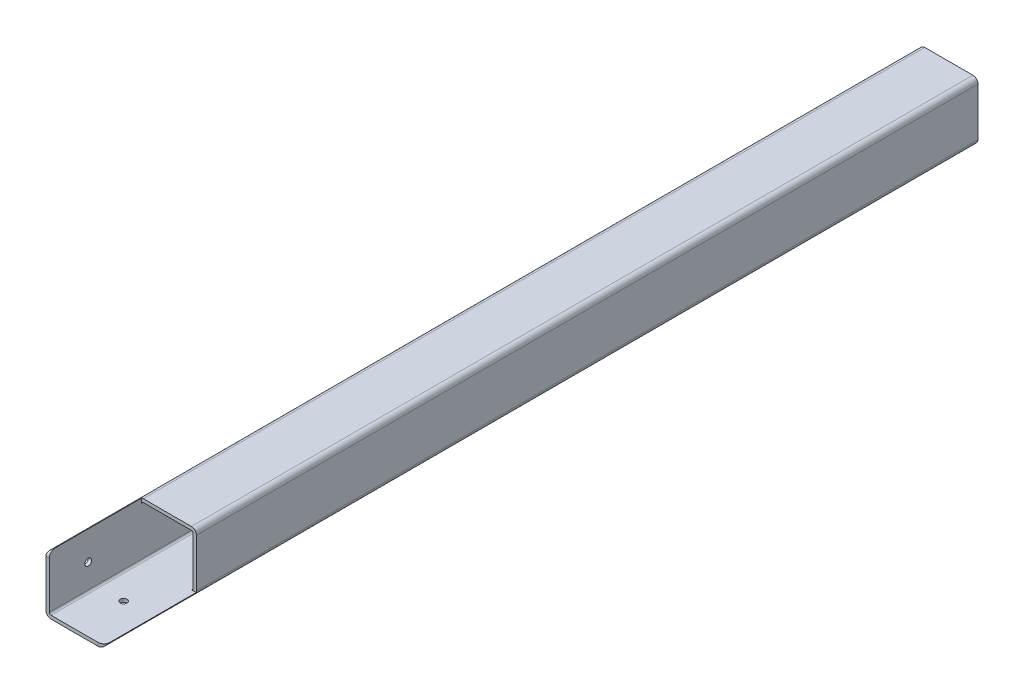
ISO-10303-21;
HEADER;
FILE_DESCRIPTION(('STEP AP214'),'2;1');
FILE_NAME('part.step','',(''),(''),'','','');
FILE_SCHEMA(('AUTOMOTIVE_DESIGN { 1 0 10303 214 1 1 1 1 }'));
ENDSEC;
DATA;
#1=APPLICATION_CONTEXT('core data for automotive mechanical design processes');
#2=APPLICATION_PROTOCOL_DEFINITION('international standard','automotive_design',2000,#1);
#3=PRODUCT_CONTEXT('',#1,'mechanical');
#4=PRODUCT('Part','Part','',(#3));
#5=PRODUCT_RELATED_PRODUCT_CATEGORY('part','',(#4));
#6=PRODUCT_DEFINITION_FORMATION('','',#4);
#7=PRODUCT_DEFINITION_CONTEXT('part definition',#1,'design');
#8=PRODUCT_DEFINITION('design','',#6,#7);
#9=PRODUCT_DEFINITION_SHAPE('','',#8);
#10=(LENGTH_UNIT() NAMED_UNIT(*) SI_UNIT(.MILLI.,.METRE.));
#11=(NAMED_UNIT(*) PLANE_ANGLE_UNIT() SI_UNIT($,.RADIAN.));
#12=(NAMED_UNIT(*) SI_UNIT($,.STERADIAN.) SOLID_ANGLE_UNIT());
#13=UNCERTAINTY_MEASURE_WITH_UNIT(LENGTH_MEASURE(1.E-05),#10,'distance_accuracy_value','');
#14=(GEOMETRIC_REPRESENTATION_CONTEXT(3) GLOBAL_UNCERTAINTY_ASSIGNED_CONTEXT((#13)) GLOBAL_UNIT_ASSIGNED_CONTEXT((#10,
#11,#12)) REPRESENTATION_CONTEXT('',''));
#15=CARTESIAN_POINT('',(0.,0.,0.));
#16=DIRECTION('',(0.,0.,1.));
#17=DIRECTION('',(1.,0.,0.));
#18=AXIS2_PLACEMENT_3D('',#15,#16,#17);
#19=CARTESIAN_POINT('',(24.75,-24.75,450.));
#20=DIRECTION('',(0.,0.,1.));
#21=DIRECTION('',(1.,0.,0.));
#22=AXIS2_PLACEMENT_3D('',#19,#20,#21);
#23=PLANE('',#22);
#24=DIRECTION('',(-1.,0.,0.));
#25=VECTOR('',#24,1.);
#26=CARTESIAN_POINT('',(30.,23.6997474683058,450.));
#27=LINE('',#26,#25);
#28=CARTESIAN_POINT('',(-26.5,23.6997474683058,450.));
#29=VERTEX_POINT('',#28);
#30=CARTESIAN_POINT('',(-30.,23.6997474683058,450.));
#31=VERTEX_POINT('',#30);
#32=EDGE_CURVE('E51',#29,#31,#27,.T.);
#33=ORIENTED_EDGE('',*,*,#32,.T.);
#34=DIRECTION('',(0.,-1.,0.));
#35=VECTOR('',#34,1.);
#36=CARTESIAN_POINT('',(-30.,24.75,450.));
#37=LINE('',#36,#35);
#38=CARTESIAN_POINT('',(-30.,-24.75,450.));
#39=VERTEX_POINT('',#38);
#40=EDGE_CURVE('E181',#31,#39,#37,.T.);
#41=ORIENTED_EDGE('',*,*,#40,.T.);
#42=CARTESIAN_POINT('',(-24.75,-24.75,450.));
#43=DIRECTION('',(0.,0.,1.));
#44=DIRECTION('',(1.,0.,0.));
#45=AXIS2_PLACEMENT_3D('',#42,#43,#44);
#46=CIRCLE('',#45,5.25);
#47=CARTESIAN_POINT('',(-24.75,-30.,450.));
#48=VERTEX_POINT('',#47);
#49=EDGE_CURVE('E191',#39,#48,#46,.T.);
#50=ORIENTED_EDGE('',*,*,#49,.T.);
#51=DIRECTION('',(1.,0.,0.));
#52=VECTOR('',#51,1.);
#53=CARTESIAN_POINT('',(-24.75,-30.,450.));
#54=LINE('',#53,#52);
#55=CARTESIAN_POINT('',(23.6997474683058,-30.,450.));
#56=VERTEX_POINT('',#55);
#57=EDGE_CURVE('E194',#48,#56,#54,.T.);
#58=ORIENTED_EDGE('',*,*,#57,.T.);
#59=DIRECTION('',(0.,-1.,0.));
#60=VECTOR('',#59,1.);
#61=CARTESIAN_POINT('',(23.6997474683058,30.,450.));
#62=LINE('',#61,#60);
#63=CARTESIAN_POINT('',(23.6997474683058,-26.5,450.));
#64=VERTEX_POINT('',#63);
#65=EDGE_CURVE('E253',#64,#56,#62,.T.);
#66=ORIENTED_EDGE('',*,*,#65,.F.);
#67=DIRECTION('',(1.,0.,0.));
#68=VECTOR('',#67,1.);
#69=CARTESIAN_POINT('',(-24.75,-26.5,450.));
#70=LINE('',#69,#68);
#71=CARTESIAN_POINT('',(-24.75,-26.5,450.));
#72=VERTEX_POINT('',#71);
#73=EDGE_CURVE('E409',#72,#64,#70,.T.);
#74=ORIENTED_EDGE('',*,*,#73,.F.);
#75=CARTESIAN_POINT('',(-24.75,-24.75,450.));
#76=DIRECTION('',(0.,0.,1.));
#77=DIRECTION('',(1.,0.,0.));
#78=AXIS2_PLACEMENT_3D('',#75,#76,#77);
#79=CIRCLE('',#78,1.75);
#80=CARTESIAN_POINT('',(-26.5,-24.75,450.));
#81=VERTEX_POINT('',#80);
#82=EDGE_CURVE('E405',#81,#72,#79,.T.);
#83=ORIENTED_EDGE('',*,*,#82,.F.);
#84=DIRECTION('',(0.,-1.,0.));
#85=VECTOR('',#84,1.);
#86=CARTESIAN_POINT('',(-26.5,24.75,450.));
#87=LINE('',#86,#85);
#88=EDGE_CURVE('E184',#29,#81,#87,.T.);
#89=ORIENTED_EDGE('',*,*,#88,.F.);
#90=EDGE_LOOP('',(#33,#41,#50,#58,#66,#74,#83,#89));
#91=FACE_BOUND('',#90,.T.);
#92=ADVANCED_FACE('F35',(#91),#23,.T.);
#93=CARTESIAN_POINT('',(30.,-24.75,450.));
#94=DIRECTION('',(-1.,0.,0.));
#95=DIRECTION('',(0.,-1.,0.));
#96=AXIS2_PLACEMENT_3D('',#93,#94,#95);
#97=PLANE('',#96);
#98=DIRECTION('',(0.,1.,0.));
#99=VECTOR('',#98,1.);
#100=CARTESIAN_POINT('',(30.,30.,355.));
#101=LINE('',#100,#99);
#102=CARTESIAN_POINT('',(30.,-24.75,355.));
#103=VERTEX_POINT('',#102);
#104=CARTESIAN_POINT('',(30.,24.75,355.));
#105=VERTEX_POINT('',#104);
#106=EDGE_CURVE('E371',#103,#105,#101,.T.);
#107=ORIENTED_EDGE('',*,*,#106,.F.);
#108=DIRECTION('',(0.,0.,-1.));
#109=VECTOR('',#108,1.);
#110=CARTESIAN_POINT('',(30.,-24.75,450.));
#111=LINE('',#110,#109);
#112=CARTESIAN_POINT('',(30.,-24.75,-450.));
#113=VERTEX_POINT('',#112);
#114=EDGE_CURVE('E237',#103,#113,#111,.T.);
#115=ORIENTED_EDGE('',*,*,#114,.T.);
#116=DIRECTION('',(0.,1.,0.));
#117=VECTOR('',#116,1.);
#118=CARTESIAN_POINT('',(30.,-24.75,-450.));
#119=LINE('',#118,#117);
#120=CARTESIAN_POINT('',(30.,24.75,-450.));
#121=VERTEX_POINT('',#120);
#122=EDGE_CURVE('E209',#113,#121,#119,.T.);
#123=ORIENTED_EDGE('',*,*,#122,.T.);
#124=DIRECTION('',(0.,0.,-1.));
#125=VECTOR('',#124,1.);
#126=CARTESIAN_POINT('',(30.,24.75,450.));
#127=LINE('',#126,#125);
#128=EDGE_CURVE('E235',#105,#121,#127,.T.);
#129=ORIENTED_EDGE('',*,*,#128,.F.);
#130=EDGE_LOOP('',(#107,#115,#123,#129));
#131=FACE_BOUND('',#130,.T.);
#132=ADVANCED_FACE('F311',(#131),#97,.F.);
#133=CARTESIAN_POINT('',(24.75,24.75,450.));
#134=DIRECTION('',(0.,0.,-1.));
#135=DIRECTION('',(-1.,0.,0.));
#136=AXIS2_PLACEMENT_3D('',#133,#134,#135);
#137=CYLINDRICAL_SURFACE('',#136,5.25);
#138=CARTESIAN_POINT('',(24.75,24.75,355.));
#139=DIRECTION('',(0.,0.,1.));
#140=DIRECTION('',(1.,0.,0.));
#141=AXIS2_PLACEMENT_3D('',#138,#139,#140);
#142=CIRCLE('',#141,5.25);
#143=CARTESIAN_POINT('',(24.75,30.,355.));
#144=VERTEX_POINT('',#143);
#145=EDGE_CURVE('E396',#105,#144,#142,.T.);
#146=ORIENTED_EDGE('',*,*,#145,.F.);
#147=ORIENTED_EDGE('',*,*,#128,.T.);
#148=CARTESIAN_POINT('',(24.75,24.75,-450.));
#149=DIRECTION('',(0.,0.,1.));
#150=DIRECTION('',(1.,0.,0.));
#151=AXIS2_PLACEMENT_3D('',#148,#149,#150);
#152=CIRCLE('',#151,5.25);
#153=CARTESIAN_POINT('',(24.75,30.,-450.));
#154=VERTEX_POINT('',#153);
#155=EDGE_CURVE('E212',#121,#154,#152,.T.);
#156=ORIENTED_EDGE('',*,*,#155,.T.);
#157=DIRECTION('',(0.,0.,-1.));
#158=VECTOR('',#157,1.);
#159=CARTESIAN_POINT('',(24.75,30.,450.));
#160=LINE('',#159,#158);
#161=EDGE_CURVE('E233',#144,#154,#160,.T.);
#162=ORIENTED_EDGE('',*,*,#161,.F.);
#163=EDGE_LOOP('',(#146,#147,#156,#162));
#164=FACE_BOUND('',#163,.T.);
#165=ADVANCED_FACE('F473',(#164),#137,.T.);
#166=CARTESIAN_POINT('',(24.75,30.,450.));
#167=DIRECTION('',(0.,-1.,0.));
#168=DIRECTION('',(1.,0.,0.));
#169=AXIS2_PLACEMENT_3D('',#166,#167,#168);
#170=PLANE('',#169);
#171=DIRECTION('',(-1.,0.,0.));
#172=VECTOR('',#171,1.);
#173=CARTESIAN_POINT('',(-26.5,30.,355.));
#174=LINE('',#173,#172);
#175=CARTESIAN_POINT('',(-24.75,30.,355.));
#176=VERTEX_POINT('',#175);
#177=EDGE_CURVE('E373',#144,#176,#174,.T.);
#178=ORIENTED_EDGE('',*,*,#177,.F.);
#179=ORIENTED_EDGE('',*,*,#161,.T.);
#180=DIRECTION('',(-1.,0.,0.));
#181=VECTOR('',#180,1.);
#182=CARTESIAN_POINT('',(24.75,30.,-450.));
#183=LINE('',#182,#181);
#184=CARTESIAN_POINT('',(-24.75,30.,-450.));
#185=VERTEX_POINT('',#184);
#186=EDGE_CURVE('E215',#154,#185,#183,.T.);
#187=ORIENTED_EDGE('',*,*,#186,.T.);
#188=DIRECTION('',(0.,0.,-1.));
#189=VECTOR('',#188,1.);
#190=CARTESIAN_POINT('',(-24.75,30.,450.));
#191=LINE('',#190,#189);
#192=EDGE_CURVE('E231',#176,#185,#191,.T.);
#193=ORIENTED_EDGE('',*,*,#192,.F.);
#194=EDGE_LOOP('',(#178,#179,#187,#193));
#195=FACE_BOUND('',#194,.T.);
#196=ADVANCED_FACE('F307',(#195),#170,.F.);
#197=CARTESIAN_POINT('',(24.75,-24.75,450.));
#198=DIRECTION('',(0.,0.,-1.));
#199=DIRECTION('',(-1.,0.,0.));
#200=AXIS2_PLACEMENT_3D('',#197,#198,#199);
#201=CYLINDRICAL_SURFACE('',#200,1.75);
#202=DIRECTION('',(0.,0.,-1.));
#203=VECTOR('',#202,1.);
#204=CARTESIAN_POINT('',(24.75,-26.5,450.));
#205=LINE('',#204,#203);
#206=CARTESIAN_POINT('',(24.75,-26.5,355.));
#207=VERTEX_POINT('',#206);
#208=CARTESIAN_POINT('',(24.75,-26.5,-450.));
#209=VERTEX_POINT('',#208);
#210=EDGE_CURVE('E411',#207,#209,#205,.T.);
#211=ORIENTED_EDGE('',*,*,#210,.F.);
#212=CARTESIAN_POINT('',(24.75,-24.75,355.));
#213=DIRECTION('',(0.,0.,1.));
#214=DIRECTION('',(1.,0.,0.));
#215=AXIS2_PLACEMENT_3D('',#212,#213,#214);
#216=CIRCLE('',#215,1.75);
#217=CARTESIAN_POINT('',(26.5,-24.75,355.));
#218=VERTEX_POINT('',#217);
#219=EDGE_CURVE('E390',#207,#218,#216,.T.);
#220=ORIENTED_EDGE('',*,*,#219,.T.);
#221=DIRECTION('',(0.,0.,-1.));
#222=VECTOR('',#221,1.);
#223=CARTESIAN_POINT('',(26.5,-24.75,450.));
#224=LINE('',#223,#222);
#225=CARTESIAN_POINT('',(26.5,-24.75,-450.));
#226=VERTEX_POINT('',#225);
#227=EDGE_CURVE('E200',#218,#226,#224,.T.);
#228=ORIENTED_EDGE('',*,*,#227,.T.);
#229=CARTESIAN_POINT('',(24.75,-24.75,-450.));
#230=DIRECTION('',(0.,0.,1.));
#231=DIRECTION('',(1.,0.,0.));
#232=AXIS2_PLACEMENT_3D('',#229,#230,#231);
#233=CIRCLE('',#232,1.75);
#234=EDGE_CURVE('E403',#209,#226,#233,.T.);
#235=ORIENTED_EDGE('',*,*,#234,.F.);
#236=EDGE_LOOP('',(#211,#220,#228,#235));
#237=FACE_BOUND('',#236,.T.);
#238=ADVANCED_FACE('F303',(#237),#201,.F.);
#239=CARTESIAN_POINT('',(26.5,-24.75,450.));
#240=DIRECTION('',(-1.,0.,0.));
#241=DIRECTION('',(0.,-1.,0.));
#242=AXIS2_PLACEMENT_3D('',#239,#240,#241);
#243=PLANE('',#242);
#244=ORIENTED_EDGE('',*,*,#227,.F.);
#245=DIRECTION('',(0.,1.,0.));
#246=VECTOR('',#245,1.);
#247=CARTESIAN_POINT('',(26.5,-24.75,355.));
#248=LINE('',#247,#246);
#249=CARTESIAN_POINT('',(26.5,24.75,355.));
#250=VERTEX_POINT('',#249);
#251=EDGE_CURVE('E387',#218,#250,#248,.T.);
#252=ORIENTED_EDGE('',*,*,#251,.T.);
#253=DIRECTION('',(0.,0.,-1.));
#254=VECTOR('',#253,1.);
#255=CARTESIAN_POINT('',(26.5,24.75,450.));
#256=LINE('',#255,#254);
#257=CARTESIAN_POINT('',(26.5,24.75,-450.));
#258=VERTEX_POINT('',#257);
#259=EDGE_CURVE('E444',#250,#258,#256,.T.);
#260=ORIENTED_EDGE('',*,*,#259,.T.);
#261=DIRECTION('',(0.,1.,0.));
#262=VECTOR('',#261,1.);
#263=CARTESIAN_POINT('',(26.5,-24.75,-450.));
#264=LINE('',#263,#262);
#265=EDGE_CURVE('E414',#226,#258,#264,.T.);
#266=ORIENTED_EDGE('',*,*,#265,.F.);
#267=EDGE_LOOP('',(#244,#252,#260,#266));
#268=FACE_BOUND('',#267,.T.);
#269=ADVANCED_FACE('F299',(#268),#243,.T.);
#270=CARTESIAN_POINT('',(24.75,24.75,450.));
#271=DIRECTION('',(0.,0.,-1.));
#272=DIRECTION('',(-1.,0.,0.));
#273=AXIS2_PLACEMENT_3D('',#270,#271,#272);
#274=CYLINDRICAL_SURFACE('',#273,1.75);
#275=ORIENTED_EDGE('',*,*,#259,.F.);
#276=CARTESIAN_POINT('',(24.75,24.75,355.));
#277=DIRECTION('',(0.,0.,1.));
#278=DIRECTION('',(1.,0.,0.));
#279=AXIS2_PLACEMENT_3D('',#276,#277,#278);
#280=CIRCLE('',#279,1.75);
#281=CARTESIAN_POINT('',(24.75,26.5,355.));
#282=VERTEX_POINT('',#281);
#283=EDGE_CURVE('E384',#250,#282,#280,.T.);
#284=ORIENTED_EDGE('',*,*,#283,.T.);
#285=DIRECTION('',(0.,0.,-1.));
#286=VECTOR('',#285,1.);
#287=CARTESIAN_POINT('',(24.75,26.5,450.));
#288=LINE('',#287,#286);
#289=CARTESIAN_POINT('',(24.75,26.5,-450.));
#290=VERTEX_POINT('',#289);
#291=EDGE_CURVE('E443',#282,#290,#288,.T.);
#292=ORIENTED_EDGE('',*,*,#291,.T.);
#293=CARTESIAN_POINT('',(24.75,24.75,-450.));
#294=DIRECTION('',(0.,0.,1.));
#295=DIRECTION('',(1.,0.,0.));
#296=AXIS2_PLACEMENT_3D('',#293,#294,#295);
#297=CIRCLE('',#296,1.75);
#298=EDGE_CURVE('E417',#258,#290,#297,.T.);
#299=ORIENTED_EDGE('',*,*,#298,.F.);
#300=EDGE_LOOP('',(#275,#284,#292,#299));
#301=FACE_BOUND('',#300,.T.);
#302=ADVANCED_FACE('F295',(#301),#274,.F.);
#303=CARTESIAN_POINT('',(24.75,26.5,450.));
#304=DIRECTION('',(0.,-1.,0.));
#305=DIRECTION('',(1.,0.,0.));
#306=AXIS2_PLACEMENT_3D('',#303,#304,#305);
#307=PLANE('',#306);
#308=ORIENTED_EDGE('',*,*,#291,.F.);
#309=DIRECTION('',(-1.,0.,0.));
#310=VECTOR('',#309,1.);
#311=CARTESIAN_POINT('',(24.75,26.5,355.));
#312=LINE('',#311,#310);
#313=CARTESIAN_POINT('',(-24.75,26.5,355.));
#314=VERTEX_POINT('',#313);
#315=EDGE_CURVE('E381',#282,#314,#312,.T.);
#316=ORIENTED_EDGE('',*,*,#315,.T.);
#317=DIRECTION('',(0.,0.,-1.));
#318=VECTOR('',#317,1.);
#319=CARTESIAN_POINT('',(-24.75,26.5,450.));
#320=LINE('',#319,#318);
#321=CARTESIAN_POINT('',(-24.75,26.5,-450.));
#322=VERTEX_POINT('',#321);
#323=EDGE_CURVE('E441',#314,#322,#320,.T.);
#324=ORIENTED_EDGE('',*,*,#323,.T.);
#325=DIRECTION('',(-1.,0.,0.));
#326=VECTOR('',#325,1.);
#327=CARTESIAN_POINT('',(24.75,26.5,-450.));
#328=LINE('',#327,#326);
#329=EDGE_CURVE('E420',#290,#322,#328,.T.);
#330=ORIENTED_EDGE('',*,*,#329,.F.);
#331=EDGE_LOOP('',(#308,#316,#324,#330));
#332=FACE_BOUND('',#331,.T.);
#333=ADVANCED_FACE('F291',(#332),#307,.T.);
#334=CARTESIAN_POINT('',(-24.75,24.75,450.));
#335=DIRECTION('',(0.,0.,-1.));
#336=DIRECTION('',(-1.,0.,0.));
#337=AXIS2_PLACEMENT_3D('',#334,#335,#336);
#338=CYLINDRICAL_SURFACE('',#337,1.75);
#339=ORIENTED_EDGE('',*,*,#323,.F.);
#340=CARTESIAN_POINT('',(-24.75,24.75,355.));
#341=DIRECTION('',(0.,0.,1.));
#342=DIRECTION('',(1.,0.,0.));
#343=AXIS2_PLACEMENT_3D('',#340,#341,#342);
#344=CIRCLE('',#343,1.75);
#345=CARTESIAN_POINT('',(-26.5,24.75,355.));
#346=VERTEX_POINT('',#345);
#347=EDGE_CURVE('E375',#314,#346,#344,.T.);
#348=ORIENTED_EDGE('',*,*,#347,.T.);
#349=DIRECTION('',(0.,0.,-1.));
#350=VECTOR('',#349,1.);
#351=CARTESIAN_POINT('',(-26.5,24.75,450.));
#352=LINE('',#351,#350);
#353=CARTESIAN_POINT('',(-26.5,24.75,-450.));
#354=VERTEX_POINT('',#353);
#355=EDGE_CURVE('E439',#346,#354,#352,.T.);
#356=ORIENTED_EDGE('',*,*,#355,.T.);
#357=CARTESIAN_POINT('',(-24.75,24.75,-450.));
#358=DIRECTION('',(0.,0.,1.));
#359=DIRECTION('',(-1.,0.,0.));
#360=AXIS2_PLACEMENT_3D('',#357,#358,#359);
#361=CIRCLE('',#360,1.75);
#362=EDGE_CURVE('E423',#322,#354,#361,.T.);
#363=ORIENTED_EDGE('',*,*,#362,.F.);
#364=EDGE_LOOP('',(#339,#348,#356,#363));
#365=FACE_BOUND('',#364,.T.);
#366=ADVANCED_FACE('F287',(#365),#338,.F.);
#367=CARTESIAN_POINT('',(24.75,-24.75,-450.));
#368=DIRECTION('',(0.,0.,1.));
#369=DIRECTION('',(1.,0.,0.));
#370=AXIS2_PLACEMENT_3D('',#367,#368,#369);
#371=PLANE('',#370);
#372=CARTESIAN_POINT('',(24.75,-24.75,-450.));
#373=DIRECTION('',(0.,0.,1.));
#374=DIRECTION('',(1.,0.,0.));
#375=AXIS2_PLACEMENT_3D('',#372,#373,#374);
#376=CIRCLE('',#375,5.25);
#377=CARTESIAN_POINT('',(24.75,-30.,-450.));
#378=VERTEX_POINT('',#377);
#379=EDGE_CURVE('E206',#378,#113,#376,.T.);
#380=ORIENTED_EDGE('',*,*,#379,.F.);
#381=DIRECTION('',(1.,0.,0.));
#382=VECTOR('',#381,1.);
#383=CARTESIAN_POINT('',(-24.75,-30.,-450.));
#384=LINE('',#383,#382);
#385=CARTESIAN_POINT('',(-24.75,-30.,-450.));
#386=VERTEX_POINT('',#385);
#387=EDGE_CURVE('E192',#386,#378,#384,.T.);
#388=ORIENTED_EDGE('',*,*,#387,.F.);
#389=CARTESIAN_POINT('',(-24.75,-24.75,-450.));
#390=DIRECTION('',(0.,0.,1.));
#391=DIRECTION('',(1.,0.,0.));
#392=AXIS2_PLACEMENT_3D('',#389,#390,#391);
#393=CIRCLE('',#392,5.25);
#394=CARTESIAN_POINT('',(-30.,-24.75,-450.));
#395=VERTEX_POINT('',#394);
#396=EDGE_CURVE('E197',#395,#386,#393,.T.);
#397=ORIENTED_EDGE('',*,*,#396,.F.);
#398=DIRECTION('',(0.,-1.,0.));
#399=VECTOR('',#398,1.);
#400=CARTESIAN_POINT('',(-30.,24.75,-450.));
#401=LINE('',#400,#399);
#402=CARTESIAN_POINT('',(-30.,24.75,-450.));
#403=VERTEX_POINT('',#402);
#404=EDGE_CURVE('E221',#403,#395,#401,.T.);
#405=ORIENTED_EDGE('',*,*,#404,.F.);
#406=CARTESIAN_POINT('',(-24.75,24.75,-450.));
#407=DIRECTION('',(0.,0.,1.));
#408=DIRECTION('',(-1.,0.,0.));
#409=AXIS2_PLACEMENT_3D('',#406,#407,#408);
#410=CIRCLE('',#409,5.25);
#411=EDGE_CURVE('E218',#185,#403,#410,.T.);
#412=ORIENTED_EDGE('',*,*,#411,.F.);
#413=ORIENTED_EDGE('',*,*,#186,.F.);
#414=ORIENTED_EDGE('',*,*,#155,.F.);
#415=ORIENTED_EDGE('',*,*,#122,.F.);
#416=EDGE_LOOP('',(#380,#388,#397,#405,#412,#413,#414,#415));
#417=FACE_BOUND('',#416,.T.);
#418=ORIENTED_EDGE('',*,*,#234,.T.);
#419=ORIENTED_EDGE('',*,*,#265,.T.);
#420=ORIENTED_EDGE('',*,*,#298,.T.);
#421=ORIENTED_EDGE('',*,*,#329,.T.);
#422=ORIENTED_EDGE('',*,*,#362,.T.);
#423=DIRECTION('',(0.,-1.,0.));
#424=VECTOR('',#423,1.);
#425=CARTESIAN_POINT('',(-26.5,24.75,-450.));
#426=LINE('',#425,#424);
#427=CARTESIAN_POINT('',(-26.5,-24.75,-450.));
#428=VERTEX_POINT('',#427);
#429=EDGE_CURVE('E426',#354,#428,#426,.T.);
#430=ORIENTED_EDGE('',*,*,#429,.T.);
#431=CARTESIAN_POINT('',(-24.75,-24.75,-450.));
#432=DIRECTION('',(0.,0.,1.));
#433=DIRECTION('',(1.,0.,0.));
#434=AXIS2_PLACEMENT_3D('',#431,#432,#433);
#435=CIRCLE('',#434,1.75);
#436=CARTESIAN_POINT('',(-24.75,-26.5,-450.));
#437=VERTEX_POINT('',#436);
#438=EDGE_CURVE('E429',#428,#437,#435,.T.);
#439=ORIENTED_EDGE('',*,*,#438,.T.);
#440=DIRECTION('',(1.,0.,0.));
#441=VECTOR('',#440,1.);
#442=CARTESIAN_POINT('',(-24.75,-26.5,-450.));
#443=LINE('',#442,#441);
#444=EDGE_CURVE('E406',#437,#209,#443,.T.);
#445=ORIENTED_EDGE('',*,*,#444,.T.);
#446=EDGE_LOOP('',(#418,#419,#420,#421,#422,#430,#439,#445));
#447=FACE_BOUND('',#446,.T.);
#448=ADVANCED_FACE('F290',(#417,#447),#371,.F.);
#449=CARTESIAN_POINT('',(24.75,-24.75,450.));
#450=DIRECTION('',(0.,0.,-1.));
#451=DIRECTION('',(-1.,0.,0.));
#452=AXIS2_PLACEMENT_3D('',#449,#450,#451);
#453=CYLINDRICAL_SURFACE('',#452,5.25);
#454=DIRECTION('',(0.,0.,-1.));
#455=VECTOR('',#454,1.);
#456=CARTESIAN_POINT('',(29.6997474683058,-26.5,450.));
#457=LINE('',#456,#455);
#458=CARTESIAN_POINT('',(29.6997474683058,-26.5,355.));
#459=VERTEX_POINT('',#458);
#460=CARTESIAN_POINT('',(29.6997474683058,-26.5,444.));
#461=VERTEX_POINT('',#460);
#462=EDGE_CURVE('E399',#459,#461,#457,.F.);
#463=ORIENTED_EDGE('',*,*,#462,.T.);
#464=CARTESIAN_POINT('',(29.6997474683058,-26.5,444.));
#465=CARTESIAN_POINT('',(29.6997676077568,-26.4998836862857,444.077667258207));
#466=CARTESIAN_POINT('',(29.6982404508508,-26.5042643089896,444.155239950783));
#467=CARTESIAN_POINT('',(29.6922677844611,-26.521050770656,444.309088299808));
#468=CARTESIAN_POINT('',(29.6878343848485,-26.5334233054197,444.385367996805));
#469=CARTESIAN_POINT('',(29.6763434406223,-26.5649091966401,444.534612842608));
#470=CARTESIAN_POINT('',(29.6693422979084,-26.5838772453071,444.607613927326));
#471=CARTESIAN_POINT('',(29.6529126805616,-26.6273634031364,444.751721565553));
#472=CARTESIAN_POINT('',(29.6434814247616,-26.6518878674866,444.822825844669));
#473=CARTESIAN_POINT('',(29.6154119917926,-26.722946522301,445.009351834555));
#474=CARTESIAN_POINT('',(29.5948082629111,-26.7733154540111,445.123007887551));
#475=CARTESIAN_POINT('',(29.5480776084736,-26.8817720407766,445.345345687008));
#476=CARTESIAN_POINT('',(29.5219468650555,-26.9398650209708,445.454023931522));
#477=CARTESIAN_POINT('',(29.4641346754799,-27.0617189064886,445.668637261115));
#478=CARTESIAN_POINT('',(29.4323832101887,-27.125545611848,445.774515686104));
#479=CARTESIAN_POINT('',(29.3637527491125,-27.2562426136915,445.982687184451));
#480=CARTESIAN_POINT('',(29.326871992309,-27.3231139501499,446.084979011271));
#481=CARTESIAN_POINT('',(29.2146805898103,-27.5158623646788,446.371814442093));
#482=CARTESIAN_POINT('',(29.1332747021276,-27.6437515881484,446.552654281079));
#483=CARTESIAN_POINT('',(28.9530949173931,-27.8997785798972,446.905432329591));
#484=CARTESIAN_POINT('',(28.8543093250698,-28.027916457714,447.077364443376));
#485=CARTESIAN_POINT('',(28.6394714817882,-28.2801279918794,447.411502490593));
#486=CARTESIAN_POINT('',(28.5235140419379,-28.4042196663583,447.573755368716));
#487=CARTESIAN_POINT('',(28.2734614948002,-28.6458894718468,447.8886409219));
#488=CARTESIAN_POINT('',(28.1393788927007,-28.7634720155857,448.041280124265));
#489=CARTESIAN_POINT('',(27.805514400779,-29.0260935438435,448.383722149787));
#490=CARTESIAN_POINT('',(27.5985686124912,-29.1675773770942,448.569406075647));
#491=CARTESIAN_POINT('',(27.1510678352307,-29.4258992543465,448.91613133295));
#492=CARTESIAN_POINT('',(26.910533218301,-29.5427521303234,449.07718747832));
#493=CARTESIAN_POINT('',(26.4476184187488,-29.7228815956091,449.339038985196));
#494=CARTESIAN_POINT('',(26.2308325742665,-29.7921609703045,449.445461436322));
#495=CARTESIAN_POINT('',(25.8930619945804,-29.8753653884766,449.586078318892));
#496=CARTESIAN_POINT('',(25.7784632086018,-29.8996373657037,449.629755673288));
#497=CARTESIAN_POINT('',(25.5456232574254,-29.9407063707495,449.71033168772));
#498=CARTESIAN_POINT('',(25.4273839755702,-29.9575071963973,449.747233786224));
#499=CARTESIAN_POINT('',(25.2161624985631,-29.980073902689,449.805989968155));
#500=CARTESIAN_POINT('',(25.1237695289425,-29.9875046385516,449.829342803965));
#501=CARTESIAN_POINT('',(24.9377256827879,-29.9974714290203,449.871672303138));
#502=CARTESIAN_POINT('',(24.8440747821403,-30.000007389662,449.890648882484));
#503=CARTESIAN_POINT('',(24.75,-30.,449.907365708983));
#504=B_SPLINE_CURVE_WITH_KNOTS('',3,(#464,#465,#466,#467,#468,#469,#470,#471,#472,#473,#474,
#475,#476,#477,#478,#479,#480,#481,#482,#483,#484,#485,#486,#487,#488,#489,#490,#491,#492,#493,
#494,#495,#496,#497,#498,#499,#500,#501,#502,#503),.UNSPECIFIED.,.F.,.F.,(4,2,2,2,2,2,2,2,2,2,2,
2,2,2,2,2,2,2,2,4),(0.,0.232712713750617,0.464461860572272,0.691398743610704,0.918596509422359,
1.29593781870381,1.67354063799967,2.05622917153924,2.43904941779663,3.14605928745651,
3.85354675567009,4.55726434189504,5.26049886328617,6.1931270915588,7.12519210634296,
7.87565082948558,8.2503224059144,8.62480330628368,8.91134452578354,9.19789124592652),.UNSPECIFIED.);
#505=CARTESIAN_POINT('',(24.75,-30.,449.907365708983));
#506=VERTEX_POINT('',#505);
#507=EDGE_CURVE('E59',#461,#506,#504,.T.);
#508=ORIENTED_EDGE('',*,*,#507,.T.);
#509=DIRECTION('',(0.,0.,-1.));
#510=VECTOR('',#509,1.);
#511=CARTESIAN_POINT('',(24.75,-30.,450.));
#512=LINE('',#511,#510);
#513=EDGE_CURVE('E205',#506,#378,#512,.T.);
#514=ORIENTED_EDGE('',*,*,#513,.T.);
#515=ORIENTED_EDGE('',*,*,#379,.T.);
#516=ORIENTED_EDGE('',*,*,#114,.F.);
#517=CARTESIAN_POINT('',(24.75,-24.75,355.));
#518=DIRECTION('',(0.,0.,1.));
#519=DIRECTION('',(1.,0.,0.));
#520=AXIS2_PLACEMENT_3D('',#517,#518,#519);
#521=CIRCLE('',#520,5.25);
#522=EDGE_CURVE('E367',#459,#103,#521,.T.);
#523=ORIENTED_EDGE('',*,*,#522,.F.);
#524=EDGE_LOOP('',(#463,#508,#514,#515,#516,#523));
#525=FACE_BOUND('',#524,.T.);
#526=ADVANCED_FACE('F37',(#525),#453,.T.);
#527=CARTESIAN_POINT('',(-24.75,24.75,450.));
#528=DIRECTION('',(0.,0.,-1.));
#529=DIRECTION('',(-1.,0.,0.));
#530=AXIS2_PLACEMENT_3D('',#527,#528,#529);
#531=CYLINDRICAL_SURFACE('',#530,5.25);
#532=DIRECTION('',(0.,0.,-1.));
#533=VECTOR('',#532,1.);
#534=CARTESIAN_POINT('',(-30.,24.75,450.));
#535=LINE('',#534,#533);
#536=CARTESIAN_POINT('',(-30.,24.75,449.907365708983));
#537=VERTEX_POINT('',#536);
#538=EDGE_CURVE('E229',#537,#403,#535,.T.);
#539=ORIENTED_EDGE('',*,*,#538,.F.);
#540=CARTESIAN_POINT('',(-30.,24.75,449.907365708983));
#541=CARTESIAN_POINT('',(-30.0000292161433,24.8798859325615,449.884307220899));
#542=CARTESIAN_POINT('',(-29.9951814623836,25.0089485291723,449.856910625219));
#543=CARTESIAN_POINT('',(-29.9763133253222,25.2642248876706,449.793925064171));
#544=CARTESIAN_POINT('',(-29.9623035453405,25.3904417684744,449.758345599755));
#545=CARTESIAN_POINT('',(-29.9258576792895,25.637991180886,449.679784047412));
#546=CARTESIAN_POINT('',(-29.9034999071578,25.7593578490441,449.636872709675));
#547=CARTESIAN_POINT('',(-29.8510583759972,25.9976389227295,449.544011770858));
#548=CARTESIAN_POINT('',(-29.8209726338774,26.1145521766008,449.494060364697));
#549=CARTESIAN_POINT('',(-29.7205342966166,26.4565990248074,449.335041145289));
#550=CARTESIAN_POINT('',(-29.6397927882215,26.6743592325853,449.216381208365));
#551=CARTESIAN_POINT('',(-29.4564524912005,27.0873396917566,448.958212727614));
#552=CARTESIAN_POINT('',(-29.3538021769056,27.2825051055324,448.818655271479));
#553=CARTESIAN_POINT('',(-29.0755128057673,27.7428115101021,448.447475896192));
#554=CARTESIAN_POINT('',(-28.8893071447078,27.9930476161682,448.205133850829));
#555=CARTESIAN_POINT('',(-28.5936313649433,28.3293114219855,447.820517092635));
#556=CARTESIAN_POINT('',(-28.4921112975195,28.4350673919999,447.688490633535));
#557=CARTESIAN_POINT('',(-28.285319730479,28.633882182728,447.417960451599));
#558=CARTESIAN_POINT('',(-28.1800493587264,28.726944780856,447.279458672297));
#559=CARTESIAN_POINT('',(-27.964310716296,28.9033994607378,446.991884977932));
#560=CARTESIAN_POINT('',(-27.8537828087164,28.986398520857,446.842618009613));
#561=CARTESIAN_POINT('',(-27.6330606979247,29.1395915572171,446.537187007476));
#562=CARTESIAN_POINT('',(-27.5228668771555,29.2097741225877,446.381016979822));
#563=CARTESIAN_POINT('',(-27.3066038245664,29.3371448378376,446.061385252109));
#564=CARTESIAN_POINT('',(-27.2005229340412,29.3943723458811,445.897947492645));
#565=CARTESIAN_POINT('',(-27.0487312987812,29.4703346773244,445.645598616117));
#566=CARTESIAN_POINT('',(-26.9993896644666,29.4939950394814,445.560349650415));
#567=CARTESIAN_POINT('',(-26.9043291872069,29.5379124447583,445.387018383368));
#568=CARTESIAN_POINT('',(-26.8586093914904,29.5581703845106,445.2989368358));
#569=CARTESIAN_POINT('',(-26.7521914678022,29.6037012840519,445.077688464765));
#570=CARTESIAN_POINT('',(-26.6944337746919,29.6269161195748,444.942628640592));
#571=CARTESIAN_POINT('',(-26.5977729930369,29.6643640276568,444.665304135204));
#572=CARTESIAN_POINT('',(-26.5587361370077,29.6786610493446,444.523098842959));
#573=CARTESIAN_POINT('',(-26.5225197179454,29.6917413386562,444.31607223452));
#574=CARTESIAN_POINT('',(-26.5141675258811,29.6947214640049,444.253437833838));
#575=CARTESIAN_POINT('',(-26.502866821104,29.6987344097116,444.127221362793));
#576=CARTESIAN_POINT('',(-26.4999533292766,29.69975461094,444.063635790346));
#577=CARTESIAN_POINT('',(-26.5,29.6997474683058,444.));
#578=B_SPLINE_CURVE_WITH_KNOTS('',3,(#540,#541,#542,#543,#544,#545,#546,#547,#548,#549,#550,
#551,#552,#553,#554,#555,#556,#557,#558,#559,#560,#561,#562,#563,#564,#565,#566,#567,#568,#569,
#570,#571,#572,#573,#574,#575,#576,#577),.UNSPECIFIED.,.F.,.F.,(4,2,2,2,2,2,2,2,2,2,2,2,2,2,2,2,
2,2,4),(0.,0.395509866403936,0.790562812709195,1.18199919081702,1.57353611677407,
2.3524557409615,3.13322784061409,4.31116289626138,4.90265315075285,5.49396699810029,
6.10375698067077,6.71408725656298,7.32253765960507,7.62631159113584,7.93000534380153,
8.37513252654523,8.81702988153088,9.00656013887813,9.19730666517017),.UNSPECIFIED.);
#579=CARTESIAN_POINT('',(-26.5,29.6997474683058,444.));
#580=VERTEX_POINT('',#579);
#581=EDGE_CURVE('E174',#537,#580,#578,.T.);
#582=ORIENTED_EDGE('',*,*,#581,.T.);
#583=DIRECTION('',(0.,0.,-1.));
#584=VECTOR('',#583,1.);
#585=CARTESIAN_POINT('',(-26.5,29.6997474683058,450.));
#586=LINE('',#585,#584);
#587=CARTESIAN_POINT('',(-26.5,29.6997474683058,355.));
#588=VERTEX_POINT('',#587);
#589=EDGE_CURVE('E401',#580,#588,#586,.T.);
#590=ORIENTED_EDGE('',*,*,#589,.T.);
#591=CARTESIAN_POINT('',(-24.75,24.75,355.));
#592=DIRECTION('',(0.,0.,1.));
#593=DIRECTION('',(1.,0.,0.));
#594=AXIS2_PLACEMENT_3D('',#591,#592,#593);
#595=CIRCLE('',#594,5.25);
#596=EDGE_CURVE('E393',#176,#588,#595,.T.);
#597=ORIENTED_EDGE('',*,*,#596,.F.);
#598=ORIENTED_EDGE('',*,*,#192,.T.);
#599=ORIENTED_EDGE('',*,*,#411,.T.);
#600=EDGE_LOOP('',(#539,#582,#590,#597,#598,#599));
#601=FACE_BOUND('',#600,.T.);
#602=ADVANCED_FACE('F324',(#601),#531,.T.);
#603=CARTESIAN_POINT('',(-30.,24.75,450.));
#604=DIRECTION('',(1.,0.,0.));
#605=DIRECTION('',(0.,1.,0.));
#606=AXIS2_PLACEMENT_3D('',#603,#604,#605);
#607=PLANE('',#606);
#608=CARTESIAN_POINT('',(-30.,0.,410.));
#609=DIRECTION('',(-1.,0.,0.));
#610=DIRECTION('',(0.,-1.,0.));
#611=AXIS2_PLACEMENT_3D('',#608,#609,#610);
#612=CIRCLE('',#611,3.50000000000002);
#613=CARTESIAN_POINT('',(-30.,-3.50000000000003,410.));
#614=VERTEX_POINT('',#613);
#615=EDGE_CURVE('E185',#614,#614,#612,.T.);
#616=ORIENTED_EDGE('',*,*,#615,.F.);
#617=EDGE_LOOP('',(#616));
#618=FACE_BOUND('',#617,.T.);
#619=ORIENTED_EDGE('',*,*,#40,.F.);
#620=CARTESIAN_POINT('',(-30.,23.6997474683058,444.));
#621=DIRECTION('',(1.,0.,0.));
#622=DIRECTION('',(0.,1.,0.));
#623=AXIS2_PLACEMENT_3D('',#620,#621,#622);
#624=CIRCLE('',#623,6.);
#625=EDGE_CURVE('E171',#537,#31,#624,.T.);
#626=ORIENTED_EDGE('',*,*,#625,.F.);
#627=ORIENTED_EDGE('',*,*,#538,.T.);
#628=ORIENTED_EDGE('',*,*,#404,.T.);
#629=DIRECTION('',(0.,0.,-1.));
#630=VECTOR('',#629,1.);
#631=CARTESIAN_POINT('',(-30.,-24.75,450.));
#632=LINE('',#631,#630);
#633=EDGE_CURVE('E189',#39,#395,#632,.T.);
#634=ORIENTED_EDGE('',*,*,#633,.F.);
#635=EDGE_LOOP('',(#619,#626,#627,#628,#634));
#636=FACE_BOUND('',#635,.T.);
#637=ADVANCED_FACE('F187',(#618,#636),#607,.F.);
#638=CARTESIAN_POINT('',(-24.75,-24.75,450.));
#639=DIRECTION('',(0.,0.,-1.));
#640=DIRECTION('',(-1.,0.,0.));
#641=AXIS2_PLACEMENT_3D('',#638,#639,#640);
#642=CYLINDRICAL_SURFACE('',#641,5.25);
#643=ORIENTED_EDGE('',*,*,#396,.T.);
#644=DIRECTION('',(0.,0.,-1.));
#645=VECTOR('',#644,1.);
#646=CARTESIAN_POINT('',(-24.75,-30.,450.));
#647=LINE('',#646,#645);
#648=EDGE_CURVE('E225',#48,#386,#647,.T.);
#649=ORIENTED_EDGE('',*,*,#648,.F.);
#650=ORIENTED_EDGE('',*,*,#49,.F.);
#651=ORIENTED_EDGE('',*,*,#633,.T.);
#652=EDGE_LOOP('',(#643,#649,#650,#651));
#653=FACE_BOUND('',#652,.T.);
#654=ADVANCED_FACE('F317',(#653),#642,.T.);
#655=CARTESIAN_POINT('',(-24.75,-30.,450.));
#656=DIRECTION('',(0.,1.,0.));
#657=DIRECTION('',(-1.,0.,0.));
#658=AXIS2_PLACEMENT_3D('',#655,#656,#657);
#659=PLANE('',#658);
#660=CARTESIAN_POINT('',(0.,-30.,400.));
#661=DIRECTION('',(0.,-1.,0.));
#662=DIRECTION('',(1.,0.,0.));
#663=AXIS2_PLACEMENT_3D('',#660,#661,#662);
#664=CIRCLE('',#663,3.5);
#665=CARTESIAN_POINT('',(3.50000000000002,-30.,400.));
#666=VERTEX_POINT('',#665);
#667=EDGE_CURVE('E247',#666,#666,#664,.T.);
#668=ORIENTED_EDGE('',*,*,#667,.F.);
#669=EDGE_LOOP('',(#668));
#670=FACE_BOUND('',#669,.T.);
#671=ORIENTED_EDGE('',*,*,#513,.F.);
#672=CARTESIAN_POINT('',(23.6997474683058,-30.,444.));
#673=DIRECTION('',(0.,1.,0.));
#674=DIRECTION('',(-1.,0.,0.));
#675=AXIS2_PLACEMENT_3D('',#672,#673,#674);
#676=CIRCLE('',#675,6.);
#677=EDGE_CURVE('E350',#56,#506,#676,.T.);
#678=ORIENTED_EDGE('',*,*,#677,.F.);
#679=ORIENTED_EDGE('',*,*,#57,.F.);
#680=ORIENTED_EDGE('',*,*,#648,.T.);
#681=ORIENTED_EDGE('',*,*,#387,.T.);
#682=EDGE_LOOP('',(#671,#678,#679,#680,#681));
#683=FACE_BOUND('',#682,.T.);
#684=ADVANCED_FACE('F285',(#670,#683),#659,.F.);
#685=CARTESIAN_POINT('',(-26.5,24.75,450.));
#686=DIRECTION('',(1.,0.,0.));
#687=DIRECTION('',(0.,1.,0.));
#688=AXIS2_PLACEMENT_3D('',#685,#686,#687);
#689=PLANE('',#688);
#690=CARTESIAN_POINT('',(-26.5,0.,410.));
#691=DIRECTION('',(1.,0.,0.));
#692=DIRECTION('',(0.,1.,0.));
#693=AXIS2_PLACEMENT_3D('',#690,#691,#692);
#694=CIRCLE('',#693,3.50000000000002);
#695=CARTESIAN_POINT('',(-26.5,-3.50000000000003,410.));
#696=VERTEX_POINT('',#695);
#697=EDGE_CURVE('E40',#696,#696,#694,.T.);
#698=ORIENTED_EDGE('',*,*,#697,.F.);
#699=EDGE_LOOP('',(#698));
#700=FACE_BOUND('',#699,.T.);
#701=CARTESIAN_POINT('',(-26.5,23.6997474683058,444.));
#702=DIRECTION('',(1.,0.,0.));
#703=DIRECTION('',(0.,1.,0.));
#704=AXIS2_PLACEMENT_3D('',#701,#702,#703);
#705=CIRCLE('',#704,6.);
#706=EDGE_CURVE('E11',#29,#580,#705,.F.);
#707=ORIENTED_EDGE('',*,*,#706,.F.);
#708=ORIENTED_EDGE('',*,*,#88,.T.);
#709=DIRECTION('',(0.,0.,-1.));
#710=VECTOR('',#709,1.);
#711=CARTESIAN_POINT('',(-26.5,-24.75,450.));
#712=LINE('',#711,#710);
#713=EDGE_CURVE('E437',#81,#428,#712,.T.);
#714=ORIENTED_EDGE('',*,*,#713,.T.);
#715=ORIENTED_EDGE('',*,*,#429,.F.);
#716=ORIENTED_EDGE('',*,*,#355,.F.);
#717=DIRECTION('',(0.,-1.,0.));
#718=VECTOR('',#717,1.);
#719=CARTESIAN_POINT('',(-26.5,30.,355.));
#720=LINE('',#719,#718);
#721=EDGE_CURVE('E242',#588,#346,#720,.T.);
#722=ORIENTED_EDGE('',*,*,#721,.F.);
#723=ORIENTED_EDGE('',*,*,#589,.F.);
#724=EDGE_LOOP('',(#707,#708,#714,#715,#716,#722,#723));
#725=FACE_BOUND('',#724,.T.);
#726=ADVANCED_FACE('F281',(#700,#725),#689,.T.);
#727=CARTESIAN_POINT('',(-24.75,-24.75,450.));
#728=DIRECTION('',(0.,0.,-1.));
#729=DIRECTION('',(-1.,0.,0.));
#730=AXIS2_PLACEMENT_3D('',#727,#728,#729);
#731=CYLINDRICAL_SURFACE('',#730,1.75);
#732=ORIENTED_EDGE('',*,*,#438,.F.);
#733=ORIENTED_EDGE('',*,*,#713,.F.);
#734=ORIENTED_EDGE('',*,*,#82,.T.);
#735=DIRECTION('',(0.,0.,-1.));
#736=VECTOR('',#735,1.);
#737=CARTESIAN_POINT('',(-24.75,-26.5,450.));
#738=LINE('',#737,#736);
#739=EDGE_CURVE('E435',#72,#437,#738,.T.);
#740=ORIENTED_EDGE('',*,*,#739,.T.);
#741=EDGE_LOOP('',(#732,#733,#734,#740));
#742=FACE_BOUND('',#741,.T.);
#743=ADVANCED_FACE('F277',(#742),#731,.F.);
#744=CARTESIAN_POINT('',(-24.75,-26.5,450.));
#745=DIRECTION('',(0.,1.,0.));
#746=DIRECTION('',(-1.,0.,0.));
#747=AXIS2_PLACEMENT_3D('',#744,#745,#746);
#748=PLANE('',#747);
#749=CARTESIAN_POINT('',(0.,-26.5,400.));
#750=DIRECTION('',(0.,1.,0.));
#751=DIRECTION('',(-1.,0.,0.));
#752=AXIS2_PLACEMENT_3D('',#749,#750,#751);
#753=CIRCLE('',#752,3.5);
#754=CARTESIAN_POINT('',(3.50000000000002,-26.5,400.));
#755=VERTEX_POINT('',#754);
#756=EDGE_CURVE('E240',#755,#755,#753,.T.);
#757=ORIENTED_EDGE('',*,*,#756,.F.);
#758=EDGE_LOOP('',(#757));
#759=FACE_BOUND('',#758,.T.);
#760=CARTESIAN_POINT('',(23.6997474683058,-26.5,444.));
#761=DIRECTION('',(0.,1.,0.));
#762=DIRECTION('',(-1.,0.,0.));
#763=AXIS2_PLACEMENT_3D('',#760,#761,#762);
#764=CIRCLE('',#763,6.);
#765=EDGE_CURVE('E45',#461,#64,#764,.F.);
#766=ORIENTED_EDGE('',*,*,#765,.F.);
#767=ORIENTED_EDGE('',*,*,#462,.F.);
#768=DIRECTION('',(1.,0.,0.));
#769=VECTOR('',#768,1.);
#770=CARTESIAN_POINT('',(-24.75,-26.5,355.));
#771=LINE('',#770,#769);
#772=EDGE_CURVE('E245',#207,#459,#771,.T.);
#773=ORIENTED_EDGE('',*,*,#772,.F.);
#774=ORIENTED_EDGE('',*,*,#210,.T.);
#775=ORIENTED_EDGE('',*,*,#444,.F.);
#776=ORIENTED_EDGE('',*,*,#739,.F.);
#777=ORIENTED_EDGE('',*,*,#73,.T.);
#778=EDGE_LOOP('',(#766,#767,#773,#774,#775,#776,#777));
#779=FACE_BOUND('',#778,.T.);
#780=ADVANCED_FACE('F273',(#759,#779),#748,.T.);
#781=CARTESIAN_POINT('',(0.,0.,355.));
#782=DIRECTION('',(0.,0.,1.));
#783=DIRECTION('',(1.,0.,0.));
#784=AXIS2_PLACEMENT_3D('',#781,#782,#783);
#785=PLANE('',#784);
#786=ORIENTED_EDGE('',*,*,#522,.T.);
#787=ORIENTED_EDGE('',*,*,#106,.T.);
#788=ORIENTED_EDGE('',*,*,#145,.T.);
#789=ORIENTED_EDGE('',*,*,#177,.T.);
#790=ORIENTED_EDGE('',*,*,#596,.T.);
#791=ORIENTED_EDGE('',*,*,#721,.T.);
#792=ORIENTED_EDGE('',*,*,#347,.F.);
#793=ORIENTED_EDGE('',*,*,#315,.F.);
#794=ORIENTED_EDGE('',*,*,#283,.F.);
#795=ORIENTED_EDGE('',*,*,#251,.F.);
#796=ORIENTED_EDGE('',*,*,#219,.F.);
#797=ORIENTED_EDGE('',*,*,#772,.T.);
#798=EDGE_LOOP('',(#786,#787,#788,#789,#790,#791,#792,#793,#794,#795,#796,#797));
#799=FACE_BOUND('',#798,.T.);
#800=ADVANCED_FACE('F269',(#799),#785,.T.);
#801=CARTESIAN_POINT('',(23.6997474683058,30.,444.));
#802=DIRECTION('',(0.,-1.,0.));
#803=DIRECTION('',(1.,0.,0.));
#804=AXIS2_PLACEMENT_3D('',#801,#802,#803);
#805=CYLINDRICAL_SURFACE('',#804,6.);
#806=ORIENTED_EDGE('',*,*,#765,.T.);
#807=ORIENTED_EDGE('',*,*,#65,.T.);
#808=ORIENTED_EDGE('',*,*,#677,.T.);
#809=ORIENTED_EDGE('',*,*,#507,.F.);
#810=EDGE_LOOP('',(#806,#807,#808,#809));
#811=FACE_BOUND('',#810,.T.);
#812=ADVANCED_FACE('F263',(#811),#805,.T.);
#813=CARTESIAN_POINT('',(0.,30.,400.));
#814=DIRECTION('',(0.,-1.,0.));
#815=DIRECTION('',(1.,0.,0.));
#816=AXIS2_PLACEMENT_3D('',#813,#814,#815);
#817=CYLINDRICAL_SURFACE('',#816,3.5);
#818=CARTESIAN_POINT('',(3.50000000000002,-26.5,400.));
#819=CARTESIAN_POINT('',(3.50000000000002,-26.5364583333333,400.));
#820=CARTESIAN_POINT('',(3.50000000000002,-26.5729166666667,400.));
#821=CARTESIAN_POINT('',(3.50000000000002,-26.6458333333333,400.));
#822=CARTESIAN_POINT('',(3.50000000000002,-26.6822916666667,400.));
#823=CARTESIAN_POINT('',(3.50000000000002,-26.7552083333333,400.));
#824=CARTESIAN_POINT('',(3.50000000000002,-26.7916666666667,400.));
#825=CARTESIAN_POINT('',(3.50000000000002,-26.8645833333333,400.));
#826=CARTESIAN_POINT('',(3.50000000000002,-26.9010416666667,400.));
#827=CARTESIAN_POINT('',(3.50000000000002,-26.9739583333333,400.));
#828=CARTESIAN_POINT('',(3.50000000000002,-27.0104166666667,400.));
#829=CARTESIAN_POINT('',(3.50000000000002,-27.0833333333333,400.));
#830=CARTESIAN_POINT('',(3.50000000000002,-27.1197916666667,400.));
#831=CARTESIAN_POINT('',(3.50000000000002,-27.1927083333333,400.));
#832=CARTESIAN_POINT('',(3.50000000000002,-27.2291666666667,400.));
#833=CARTESIAN_POINT('',(3.50000000000002,-27.3020833333333,400.));
#834=CARTESIAN_POINT('',(3.50000000000002,-27.3385416666667,400.));
#835=CARTESIAN_POINT('',(3.50000000000002,-27.4114583333333,400.));
#836=CARTESIAN_POINT('',(3.50000000000002,-27.4479166666667,400.));
#837=CARTESIAN_POINT('',(3.50000000000002,-27.5208333333333,400.));
#838=CARTESIAN_POINT('',(3.50000000000002,-27.5572916666667,400.));
#839=CARTESIAN_POINT('',(3.50000000000002,-27.6302083333333,400.));
#840=CARTESIAN_POINT('',(3.50000000000002,-27.6666666666667,400.));
#841=CARTESIAN_POINT('',(3.50000000000002,-27.7395833333333,400.));
#842=CARTESIAN_POINT('',(3.50000000000002,-27.7760416666667,400.));
#843=CARTESIAN_POINT('',(3.50000000000002,-27.8489583333333,400.));
#844=CARTESIAN_POINT('',(3.50000000000002,-27.8854166666667,400.));
#845=CARTESIAN_POINT('',(3.50000000000002,-27.9583333333333,400.));
#846=CARTESIAN_POINT('',(3.50000000000002,-27.9947916666667,400.));
#847=CARTESIAN_POINT('',(3.50000000000002,-28.0677083333333,400.));
#848=CARTESIAN_POINT('',(3.50000000000002,-28.1041666666667,400.));
#849=CARTESIAN_POINT('',(3.50000000000002,-28.1770833333333,400.));
#850=CARTESIAN_POINT('',(3.50000000000002,-28.2135416666667,400.));
#851=CARTESIAN_POINT('',(3.50000000000002,-28.2864583333333,400.));
#852=CARTESIAN_POINT('',(3.50000000000002,-28.3229166666667,400.));
#853=CARTESIAN_POINT('',(3.50000000000002,-28.3958333333333,400.));
#854=CARTESIAN_POINT('',(3.50000000000002,-28.4322916666667,400.));
#855=CARTESIAN_POINT('',(3.50000000000002,-28.5052083333333,400.));
#856=CARTESIAN_POINT('',(3.50000000000002,-28.5416666666667,400.));
#857=CARTESIAN_POINT('',(3.50000000000002,-28.6145833333333,400.));
#858=CARTESIAN_POINT('',(3.50000000000002,-28.6510416666667,400.));
#859=CARTESIAN_POINT('',(3.50000000000002,-28.7239583333333,400.));
#860=CARTESIAN_POINT('',(3.50000000000002,-28.7604166666667,400.));
#861=CARTESIAN_POINT('',(3.50000000000002,-28.8333333333333,400.));
#862=CARTESIAN_POINT('',(3.50000000000002,-28.8697916666667,400.));
#863=CARTESIAN_POINT('',(3.50000000000002,-28.9427083333333,400.));
#864=CARTESIAN_POINT('',(3.50000000000002,-28.9791666666667,400.));
#865=CARTESIAN_POINT('',(3.50000000000002,-29.0520833333333,400.));
#866=CARTESIAN_POINT('',(3.50000000000002,-29.0885416666667,400.));
#867=CARTESIAN_POINT('',(3.50000000000002,-29.1614583333333,400.));
#868=CARTESIAN_POINT('',(3.50000000000002,-29.1979166666667,400.));
#869=CARTESIAN_POINT('',(3.50000000000002,-29.2708333333333,400.));
#870=CARTESIAN_POINT('',(3.50000000000002,-29.3072916666667,400.));
#871=CARTESIAN_POINT('',(3.50000000000002,-29.3802083333333,400.));
#872=CARTESIAN_POINT('',(3.50000000000002,-29.4166666666667,400.));
#873=CARTESIAN_POINT('',(3.50000000000002,-29.4895833333333,400.));
#874=CARTESIAN_POINT('',(3.50000000000002,-29.5260416666667,400.));
#875=CARTESIAN_POINT('',(3.50000000000002,-29.5989583333333,400.));
#876=CARTESIAN_POINT('',(3.50000000000002,-29.6354166666667,400.));
#877=CARTESIAN_POINT('',(3.50000000000002,-29.7083333333333,400.));
#878=CARTESIAN_POINT('',(3.50000000000002,-29.7447916666667,400.));
#879=CARTESIAN_POINT('',(3.50000000000002,-29.8177083333333,400.));
#880=CARTESIAN_POINT('',(3.50000000000002,-29.8541666666667,400.));
#881=CARTESIAN_POINT('',(3.50000000000002,-29.9270833333333,400.));
#882=CARTESIAN_POINT('',(3.50000000000002,-29.9635416666667,400.));
#883=CARTESIAN_POINT('',(3.50000000000002,-30.,400.));
#884=B_SPLINE_CURVE_WITH_KNOTS('',3,(#818,#819,#820,#821,#822,#823,#824,#825,#826,#827,#828,
#829,#830,#831,#832,#833,#834,#835,#836,#837,#838,#839,#840,#841,#842,#843,#844,#845,#846,#847,
#848,#849,#850,#851,#852,#853,#854,#855,#856,#857,#858,#859,#860,#861,#862,#863,#864,#865,#866,
#867,#868,#869,#870,#871,#872,#873,#874,#875,#876,#877,#878,#879,#880,#881,#882,#883),
.UNSPECIFIED.,.F.,.F.,(4,2,2,2,2,2,2,2,2,2,2,2,2,2,2,2,2,2,2,2,2,2,2,2,2,2,2,2,2,2,2,2,4),(0.,
0.109375000000002,0.218750000000004,0.328124999999999,0.4375,0.546875000000002,
0.656249999999997,0.765624999999999,0.875000000000001,0.984375000000003,1.09375,1.203125,1.3125,
1.421875,1.53125,1.640625,1.75,1.859375,1.96875000000001,2.078125,2.1875,2.296875,2.40625,
2.515625,2.625,2.734375,2.84375000000001,2.953125,3.0625,3.171875,3.28125,3.390625,3.5),.UNSPECIFIED.);
#885=EDGE_CURVE('BSEAM268',#755,#666,#884,.T.);
#886=ORIENTED_EDGE('',*,*,#756,.T.);
#887=ORIENTED_EDGE('',*,*,#667,.T.);
#888=ORIENTED_EDGE('',*,*,#885,.T.);
#889=ORIENTED_EDGE('',*,*,#885,.F.);
#890=EDGE_LOOP('',(#886,#888,#887,#889));
#891=FACE_BOUND('',#890,.T.);
#892=ADVANCED_FACE('F268',(#891),#817,.F.);
#893=CARTESIAN_POINT('',(30.,23.6997474683058,444.));
#894=DIRECTION('',(-1.,0.,0.));
#895=DIRECTION('',(0.,-1.,0.));
#896=AXIS2_PLACEMENT_3D('',#893,#894,#895);
#897=CYLINDRICAL_SURFACE('',#896,6.);
#898=ORIENTED_EDGE('',*,*,#625,.T.);
#899=ORIENTED_EDGE('',*,*,#32,.F.);
#900=ORIENTED_EDGE('',*,*,#706,.T.);
#901=ORIENTED_EDGE('',*,*,#581,.F.);
#902=EDGE_LOOP('',(#898,#899,#900,#901));
#903=FACE_BOUND('',#902,.T.);
#904=ADVANCED_FACE('F172',(#903),#897,.T.);
#905=CARTESIAN_POINT('',(30.,0.,410.));
#906=DIRECTION('',(-1.,0.,0.));
#907=DIRECTION('',(0.,-1.,0.));
#908=AXIS2_PLACEMENT_3D('',#905,#906,#907);
#909=CYLINDRICAL_SURFACE('',#908,3.50000000000002);
#910=CARTESIAN_POINT('',(-26.5,-3.50000000000003,410.));
#911=CARTESIAN_POINT('',(-26.5364583333333,-3.50000000000003,410.));
#912=CARTESIAN_POINT('',(-26.5729166666667,-3.50000000000003,410.));
#913=CARTESIAN_POINT('',(-26.6458333333333,-3.50000000000003,410.));
#914=CARTESIAN_POINT('',(-26.6822916666667,-3.50000000000003,410.));
#915=CARTESIAN_POINT('',(-26.7552083333333,-3.50000000000003,410.));
#916=CARTESIAN_POINT('',(-26.7916666666667,-3.50000000000003,410.));
#917=CARTESIAN_POINT('',(-26.8645833333333,-3.50000000000003,410.));
#918=CARTESIAN_POINT('',(-26.9010416666667,-3.50000000000003,410.));
#919=CARTESIAN_POINT('',(-26.9739583333333,-3.50000000000003,410.));
#920=CARTESIAN_POINT('',(-27.0104166666667,-3.50000000000003,410.));
#921=CARTESIAN_POINT('',(-27.0833333333333,-3.50000000000003,410.));
#922=CARTESIAN_POINT('',(-27.1197916666667,-3.50000000000003,410.));
#923=CARTESIAN_POINT('',(-27.1927083333333,-3.50000000000003,410.));
#924=CARTESIAN_POINT('',(-27.2291666666667,-3.50000000000003,410.));
#925=CARTESIAN_POINT('',(-27.3020833333333,-3.50000000000003,410.));
#926=CARTESIAN_POINT('',(-27.3385416666667,-3.50000000000003,410.));
#927=CARTESIAN_POINT('',(-27.4114583333333,-3.50000000000003,410.));
#928=CARTESIAN_POINT('',(-27.4479166666667,-3.50000000000003,410.));
#929=CARTESIAN_POINT('',(-27.5208333333333,-3.50000000000003,410.));
#930=CARTESIAN_POINT('',(-27.5572916666667,-3.50000000000003,410.));
#931=CARTESIAN_POINT('',(-27.6302083333333,-3.50000000000003,410.));
#932=CARTESIAN_POINT('',(-27.6666666666667,-3.50000000000003,410.));
#933=CARTESIAN_POINT('',(-27.7395833333333,-3.50000000000003,410.));
#934=CARTESIAN_POINT('',(-27.7760416666667,-3.50000000000003,410.));
#935=CARTESIAN_POINT('',(-27.8489583333333,-3.50000000000003,410.));
#936=CARTESIAN_POINT('',(-27.8854166666667,-3.50000000000003,410.));
#937=CARTESIAN_POINT('',(-27.9583333333333,-3.50000000000003,410.));
#938=CARTESIAN_POINT('',(-27.9947916666667,-3.50000000000003,410.));
#939=CARTESIAN_POINT('',(-28.0677083333333,-3.50000000000003,410.));
#940=CARTESIAN_POINT('',(-28.1041666666667,-3.50000000000003,410.));
#941=CARTESIAN_POINT('',(-28.1770833333333,-3.50000000000003,410.));
#942=CARTESIAN_POINT('',(-28.2135416666667,-3.50000000000003,410.));
#943=CARTESIAN_POINT('',(-28.2864583333333,-3.50000000000003,410.));
#944=CARTESIAN_POINT('',(-28.3229166666667,-3.50000000000003,410.));
#945=CARTESIAN_POINT('',(-28.3958333333333,-3.50000000000003,410.));
#946=CARTESIAN_POINT('',(-28.4322916666667,-3.50000000000003,410.));
#947=CARTESIAN_POINT('',(-28.5052083333333,-3.50000000000003,410.));
#948=CARTESIAN_POINT('',(-28.5416666666667,-3.50000000000003,410.));
#949=CARTESIAN_POINT('',(-28.6145833333333,-3.50000000000003,410.));
#950=CARTESIAN_POINT('',(-28.6510416666667,-3.50000000000003,410.));
#951=CARTESIAN_POINT('',(-28.7239583333333,-3.50000000000003,410.));
#952=CARTESIAN_POINT('',(-28.7604166666667,-3.50000000000003,410.));
#953=CARTESIAN_POINT('',(-28.8333333333333,-3.50000000000003,410.));
#954=CARTESIAN_POINT('',(-28.8697916666667,-3.50000000000003,410.));
#955=CARTESIAN_POINT('',(-28.9427083333333,-3.50000000000003,410.));
#956=CARTESIAN_POINT('',(-28.9791666666667,-3.50000000000003,410.));
#957=CARTESIAN_POINT('',(-29.0520833333333,-3.50000000000003,410.));
#958=CARTESIAN_POINT('',(-29.0885416666667,-3.50000000000003,410.));
#959=CARTESIAN_POINT('',(-29.1614583333333,-3.50000000000003,410.));
#960=CARTESIAN_POINT('',(-29.1979166666667,-3.50000000000003,410.));
#961=CARTESIAN_POINT('',(-29.2708333333333,-3.50000000000003,410.));
#962=CARTESIAN_POINT('',(-29.3072916666667,-3.50000000000003,410.));
#963=CARTESIAN_POINT('',(-29.3802083333333,-3.50000000000003,410.));
#964=CARTESIAN_POINT('',(-29.4166666666667,-3.50000000000003,410.));
#965=CARTESIAN_POINT('',(-29.4895833333333,-3.50000000000003,410.));
#966=CARTESIAN_POINT('',(-29.5260416666667,-3.50000000000003,410.));
#967=CARTESIAN_POINT('',(-29.5989583333333,-3.50000000000003,410.));
#968=CARTESIAN_POINT('',(-29.6354166666667,-3.50000000000003,410.));
#969=CARTESIAN_POINT('',(-29.7083333333333,-3.50000000000003,410.));
#970=CARTESIAN_POINT('',(-29.7447916666667,-3.50000000000003,410.));
#971=CARTESIAN_POINT('',(-29.8177083333333,-3.50000000000003,410.));
#972=CARTESIAN_POINT('',(-29.8541666666667,-3.50000000000003,410.));
#973=CARTESIAN_POINT('',(-29.9270833333333,-3.50000000000003,410.));
#974=CARTESIAN_POINT('',(-29.9635416666667,-3.50000000000003,410.));
#975=CARTESIAN_POINT('',(-30.,-3.50000000000003,410.));
#976=B_SPLINE_CURVE_WITH_KNOTS('',3,(#910,#911,#912,#913,#914,#915,#916,#917,#918,#919,#920,
#921,#922,#923,#924,#925,#926,#927,#928,#929,#930,#931,#932,#933,#934,#935,#936,#937,#938,#939,
#940,#941,#942,#943,#944,#945,#946,#947,#948,#949,#950,#951,#952,#953,#954,#955,#956,#957,#958,
#959,#960,#961,#962,#963,#964,#965,#966,#967,#968,#969,#970,#971,#972,#973,#974,#975),
.UNSPECIFIED.,.F.,.F.,(4,2,2,2,2,2,2,2,2,2,2,2,2,2,2,2,2,2,2,2,2,2,2,2,2,2,2,2,2,2,2,2,4),(0.,
0.109375000000002,0.218750000000004,0.328124999999999,0.4375,0.546875000000002,
0.656249999999997,0.765624999999999,0.875000000000001,0.984375000000003,1.09375,1.203125,1.3125,
1.421875,1.53125,1.640625,1.75,1.859375,1.96875000000001,2.078125,2.1875,2.296875,2.40625,
2.515625,2.625,2.734375,2.84375000000001,2.953125,3.0625,3.171875,3.28125,3.390625,3.5),.UNSPECIFIED.);
#977=EDGE_CURVE('BSEAM339',#696,#614,#976,.T.);
#978=ORIENTED_EDGE('',*,*,#697,.T.);
#979=ORIENTED_EDGE('',*,*,#615,.T.);
#980=ORIENTED_EDGE('',*,*,#977,.T.);
#981=ORIENTED_EDGE('',*,*,#977,.F.);
#982=EDGE_LOOP('',(#978,#980,#979,#981));
#983=FACE_BOUND('',#982,.T.);
#984=ADVANCED_FACE('F339',(#983),#909,.F.);
#985=CLOSED_SHELL('',(#92,#132,#165,#196,#238,#269,#302,#333,#366,#448,#526,#602,#637,#654,#684,
#726,#743,#780,#800,#812,#892,#904,#984));
#986=MANIFOLD_SOLID_BREP('B2',#985);
#987=ADVANCED_BREP_SHAPE_REPRESENTATION('',(#18,#986),#14);
#988=SHAPE_DEFINITION_REPRESENTATION(#9,#987);
ENDSEC;
END-ISO-10303-21;
